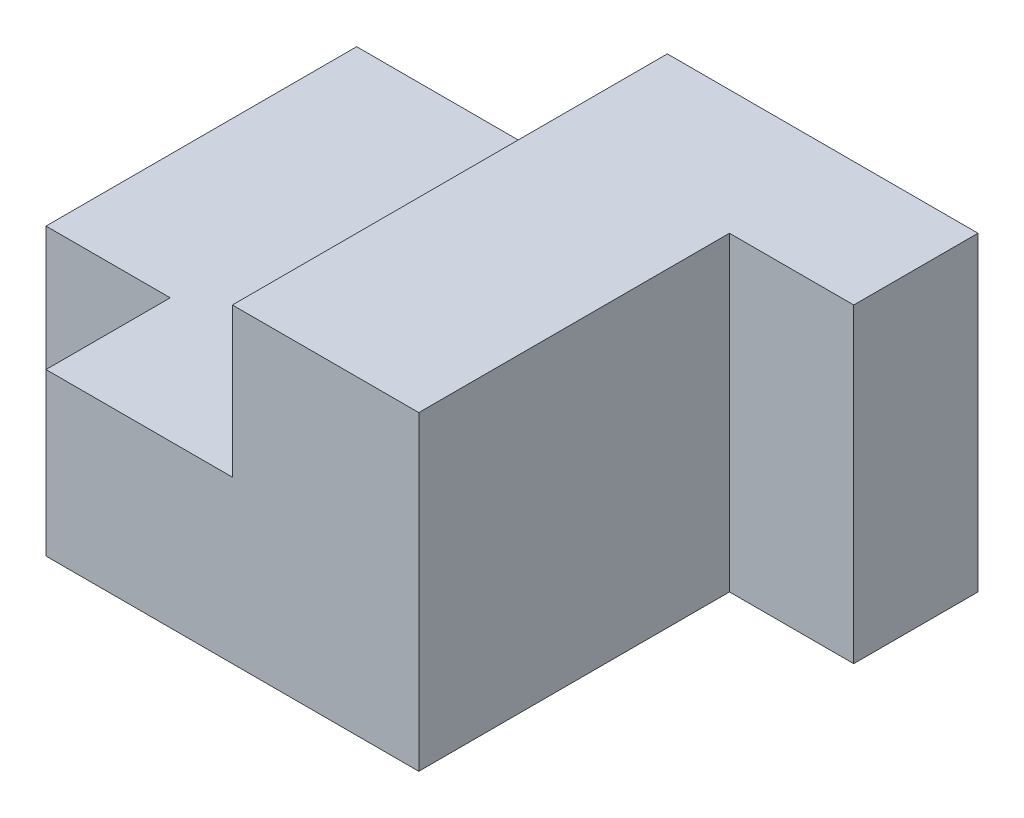
ISO-10303-21;
HEADER;
FILE_DESCRIPTION(('STEP AP214'),'2;1');
FILE_NAME('part.step','',(''),(''),'','','');
FILE_SCHEMA(('AUTOMOTIVE_DESIGN { 1 0 10303 214 1 1 1 1 }'));
ENDSEC;
DATA;
#1=APPLICATION_CONTEXT('core data for automotive mechanical design processes');
#2=APPLICATION_PROTOCOL_DEFINITION('international standard','automotive_design',2000,#1);
#3=PRODUCT_CONTEXT('',#1,'mechanical');
#4=PRODUCT('Part','Part','',(#3));
#5=PRODUCT_RELATED_PRODUCT_CATEGORY('part','',(#4));
#6=PRODUCT_DEFINITION_FORMATION('','',#4);
#7=PRODUCT_DEFINITION_CONTEXT('part definition',#1,'design');
#8=PRODUCT_DEFINITION('design','',#6,#7);
#9=PRODUCT_DEFINITION_SHAPE('','',#8);
#10=(LENGTH_UNIT() NAMED_UNIT(*) SI_UNIT(.MILLI.,.METRE.));
#11=(NAMED_UNIT(*) PLANE_ANGLE_UNIT() SI_UNIT($,.RADIAN.));
#12=(NAMED_UNIT(*) SI_UNIT($,.STERADIAN.) SOLID_ANGLE_UNIT());
#13=UNCERTAINTY_MEASURE_WITH_UNIT(LENGTH_MEASURE(1.E-05),#10,'distance_accuracy_value','');
#14=(GEOMETRIC_REPRESENTATION_CONTEXT(3) GLOBAL_UNCERTAINTY_ASSIGNED_CONTEXT((#13)) GLOBAL_UNIT_ASSIGNED_CONTEXT((#10,
#11,#12)) REPRESENTATION_CONTEXT('',''));
#15=CARTESIAN_POINT('',(0.,0.,0.));
#16=DIRECTION('',(0.,0.,1.));
#17=DIRECTION('',(1.,0.,0.));
#18=AXIS2_PLACEMENT_3D('',#15,#16,#17);
#19=CARTESIAN_POINT('',(-22.5742574257426,50.,36.8811881188119));
#20=DIRECTION('',(1.,0.,0.));
#21=DIRECTION('',(0.,0.,-1.));
#22=AXIS2_PLACEMENT_3D('',#19,#20,#21);
#23=PLANE('',#22);
#24=DIRECTION('',(0.,0.,-1.));
#25=VECTOR('',#24,1.);
#26=CARTESIAN_POINT('',(-22.5742574257426,26.,-33.1188118811881));
#27=LINE('',#26,#25);
#28=CARTESIAN_POINT('',(-22.5742574257426,26.,36.8811881188119));
#29=VERTEX_POINT('',#28);
#30=CARTESIAN_POINT('',(-22.5742574257426,26.,-33.1188118811881));
#31=VERTEX_POINT('',#30);
#32=EDGE_CURVE('E49',#29,#31,#27,.T.);
#33=ORIENTED_EDGE('',*,*,#32,.F.);
#34=DIRECTION('',(0.,-1.,0.));
#35=VECTOR('',#34,1.);
#36=CARTESIAN_POINT('',(-22.5742574257426,50.,36.8811881188119));
#37=LINE('',#36,#35);
#38=CARTESIAN_POINT('',(-22.5742574257426,50.,36.8811881188119));
#39=VERTEX_POINT('',#38);
#40=EDGE_CURVE('E43',#39,#29,#37,.T.);
#41=ORIENTED_EDGE('',*,*,#40,.F.);
#42=DIRECTION('',(0.,0.,1.));
#43=VECTOR('',#42,1.);
#44=CARTESIAN_POINT('',(-22.5742574257426,50.,36.8811881188119));
#45=LINE('',#44,#43);
#46=CARTESIAN_POINT('',(-22.5742574257426,50.,-33.1188118811881));
#47=VERTEX_POINT('',#46);
#48=EDGE_CURVE('E85',#47,#39,#45,.T.);
#49=ORIENTED_EDGE('',*,*,#48,.F.);
#50=DIRECTION('',(0.,-1.,0.));
#51=VECTOR('',#50,1.);
#52=CARTESIAN_POINT('',(-22.5742574257426,50.,-33.1188118811881));
#53=LINE('',#52,#51);
#54=EDGE_CURVE('E11',#47,#31,#53,.T.);
#55=ORIENTED_EDGE('',*,*,#54,.T.);
#56=EDGE_LOOP('',(#33,#41,#49,#55));
#57=FACE_BOUND('',#56,.T.);
#58=ADVANCED_FACE('F35',(#57),#23,.F.);
#59=CARTESIAN_POINT('',(-22.5742574257426,50.,-33.1188118811881));
#60=DIRECTION('',(0.,0.,1.));
#61=DIRECTION('',(1.,0.,0.));
#62=AXIS2_PLACEMENT_3D('',#59,#60,#61);
#63=PLANE('',#62);
#64=DIRECTION('',(-1.,0.,0.));
#65=VECTOR('',#64,1.);
#66=CARTESIAN_POINT('',(-22.5742574257426,0.,-33.1188118811881));
#67=LINE('',#66,#65);
#68=CARTESIAN_POINT('',(27.4257425742574,0.,-33.1188118811881));
#69=VERTEX_POINT('',#68);
#70=CARTESIAN_POINT('',(-72.5742574257426,0.,-33.1188118811881));
#71=VERTEX_POINT('',#70);
#72=EDGE_CURVE('E123',#69,#71,#67,.T.);
#73=ORIENTED_EDGE('',*,*,#72,.T.);
#74=DIRECTION('',(0.,-1.,0.));
#75=VECTOR('',#74,1.);
#76=CARTESIAN_POINT('',(-72.5742574257426,26.,-33.1188118811881));
#77=LINE('',#76,#75);
#78=CARTESIAN_POINT('',(-72.5742574257426,26.,-33.1188118811881));
#79=VERTEX_POINT('',#78);
#80=EDGE_CURVE('E127',#79,#71,#77,.T.);
#81=ORIENTED_EDGE('',*,*,#80,.F.);
#82=DIRECTION('',(-1.,0.,0.));
#83=VECTOR('',#82,1.);
#84=CARTESIAN_POINT('',(-22.5742574257426,26.,-33.1188118811881));
#85=LINE('',#84,#83);
#86=EDGE_CURVE('E181',#31,#79,#85,.T.);
#87=ORIENTED_EDGE('',*,*,#86,.F.);
#88=ORIENTED_EDGE('',*,*,#54,.F.);
#89=DIRECTION('',(-1.,0.,0.));
#90=VECTOR('',#89,1.);
#91=CARTESIAN_POINT('',(-22.5742574257426,50.,-33.1188118811881));
#92=LINE('',#91,#90);
#93=CARTESIAN_POINT('',(27.4257425742574,50.,-33.1188118811881));
#94=VERTEX_POINT('',#93);
#95=EDGE_CURVE('E133',#94,#47,#92,.T.);
#96=ORIENTED_EDGE('',*,*,#95,.F.);
#97=DIRECTION('',(0.,-1.,0.));
#98=VECTOR('',#97,1.);
#99=CARTESIAN_POINT('',(27.4257425742574,50.,-33.1188118811881));
#100=LINE('',#99,#98);
#101=EDGE_CURVE('E119',#94,#69,#100,.T.);
#102=ORIENTED_EDGE('',*,*,#101,.T.);
#103=EDGE_LOOP('',(#73,#81,#87,#88,#96,#102));
#104=FACE_BOUND('',#103,.T.);
#105=ADVANCED_FACE('F37',(#104),#63,.F.);
#106=CARTESIAN_POINT('',(7.4257425742574,50.,36.8811881188119));
#107=DIRECTION('',(0.,0.,-1.));
#108=DIRECTION('',(-1.,0.,0.));
#109=AXIS2_PLACEMENT_3D('',#106,#107,#108);
#110=PLANE('',#109);
#111=DIRECTION('',(1.,0.,0.));
#112=VECTOR('',#111,1.);
#113=CARTESIAN_POINT('',(7.4257425742574,0.,36.8811881188119));
#114=LINE('',#113,#112);
#115=CARTESIAN_POINT('',(-52.5742574257426,0.,36.8811881188119));
#116=VERTEX_POINT('',#115);
#117=CARTESIAN_POINT('',(7.4257425742574,0.,36.8811881188119));
#118=VERTEX_POINT('',#117);
#119=EDGE_CURVE('E126',#116,#118,#114,.T.);
#120=ORIENTED_EDGE('',*,*,#119,.T.);
#121=DIRECTION('',(0.,-1.,0.));
#122=VECTOR('',#121,1.);
#123=CARTESIAN_POINT('',(7.4257425742574,50.,36.8811881188119));
#124=LINE('',#123,#122);
#125=CARTESIAN_POINT('',(7.4257425742574,50.,36.8811881188119));
#126=VERTEX_POINT('',#125);
#127=EDGE_CURVE('E114',#126,#118,#124,.T.);
#128=ORIENTED_EDGE('',*,*,#127,.F.);
#129=DIRECTION('',(1.,0.,0.));
#130=VECTOR('',#129,1.);
#131=CARTESIAN_POINT('',(7.4257425742574,50.,36.8811881188119));
#132=LINE('',#131,#130);
#133=EDGE_CURVE('E102',#39,#126,#132,.T.);
#134=ORIENTED_EDGE('',*,*,#133,.F.);
#135=ORIENTED_EDGE('',*,*,#40,.T.);
#136=DIRECTION('',(1.,0.,0.));
#137=VECTOR('',#136,1.);
#138=CARTESIAN_POINT('',(-22.5742574257426,26.,36.8811881188119));
#139=LINE('',#138,#137);
#140=CARTESIAN_POINT('',(-52.5742574257426,26.,36.8811881188119));
#141=VERTEX_POINT('',#140);
#142=EDGE_CURVE('E141',#141,#29,#139,.T.);
#143=ORIENTED_EDGE('',*,*,#142,.F.);
#144=DIRECTION('',(0.,-1.,0.));
#145=VECTOR('',#144,1.);
#146=CARTESIAN_POINT('',(-52.5742574257426,26.,36.8811881188119));
#147=LINE('',#146,#145);
#148=EDGE_CURVE('E151',#141,#116,#147,.T.);
#149=ORIENTED_EDGE('',*,*,#148,.T.);
#150=EDGE_LOOP('',(#120,#128,#134,#135,#143,#149));
#151=FACE_BOUND('',#150,.T.);
#152=ADVANCED_FACE('F139',(#151),#110,.F.);
#153=CARTESIAN_POINT('',(7.42574257425739,50.,-13.1188118811881));
#154=DIRECTION('',(-1.,0.,0.));
#155=DIRECTION('',(0.,0.,1.));
#156=AXIS2_PLACEMENT_3D('',#153,#154,#155);
#157=PLANE('',#156);
#158=DIRECTION('',(0.,0.,-1.));
#159=VECTOR('',#158,1.);
#160=CARTESIAN_POINT('',(7.42574257425739,0.,-13.1188118811881));
#161=LINE('',#160,#159);
#162=CARTESIAN_POINT('',(7.42574257425739,0.,-13.1188118811881));
#163=VERTEX_POINT('',#162);
#164=EDGE_CURVE('E111',#118,#163,#161,.T.);
#165=ORIENTED_EDGE('',*,*,#164,.T.);
#166=DIRECTION('',(0.,-1.,0.));
#167=VECTOR('',#166,1.);
#168=CARTESIAN_POINT('',(7.42574257425739,50.,-13.1188118811881));
#169=LINE('',#168,#167);
#170=CARTESIAN_POINT('',(7.42574257425739,50.,-13.1188118811881));
#171=VERTEX_POINT('',#170);
#172=EDGE_CURVE('E108',#171,#163,#169,.T.);
#173=ORIENTED_EDGE('',*,*,#172,.F.);
#174=DIRECTION('',(0.,0.,-1.));
#175=VECTOR('',#174,1.);
#176=CARTESIAN_POINT('',(7.42574257425739,50.,-13.1188118811881));
#177=LINE('',#176,#175);
#178=EDGE_CURVE('E95',#126,#171,#177,.T.);
#179=ORIENTED_EDGE('',*,*,#178,.F.);
#180=ORIENTED_EDGE('',*,*,#127,.T.);
#181=EDGE_LOOP('',(#165,#173,#179,#180));
#182=FACE_BOUND('',#181,.T.);
#183=ADVANCED_FACE('F109',(#182),#157,.F.);
#184=CARTESIAN_POINT('',(27.4257425742574,50.,-13.1188118811881));
#185=DIRECTION('',(0.,0.,-1.));
#186=DIRECTION('',(-1.,0.,0.));
#187=AXIS2_PLACEMENT_3D('',#184,#185,#186);
#188=PLANE('',#187);
#189=DIRECTION('',(1.,0.,0.));
#190=VECTOR('',#189,1.);
#191=CARTESIAN_POINT('',(27.4257425742574,0.,-13.1188118811881));
#192=LINE('',#191,#190);
#193=CARTESIAN_POINT('',(27.4257425742574,0.,-13.1188118811881));
#194=VERTEX_POINT('',#193);
#195=EDGE_CURVE('E130',#163,#194,#192,.T.);
#196=ORIENTED_EDGE('',*,*,#195,.T.);
#197=DIRECTION('',(0.,-1.,0.));
#198=VECTOR('',#197,1.);
#199=CARTESIAN_POINT('',(27.4257425742574,50.,-13.1188118811881));
#200=LINE('',#199,#198);
#201=CARTESIAN_POINT('',(27.4257425742574,50.,-13.1188118811881));
#202=VERTEX_POINT('',#201);
#203=EDGE_CURVE('E115',#202,#194,#200,.T.);
#204=ORIENTED_EDGE('',*,*,#203,.F.);
#205=DIRECTION('',(1.,0.,0.));
#206=VECTOR('',#205,1.);
#207=CARTESIAN_POINT('',(27.4257425742574,50.,-13.1188118811881));
#208=LINE('',#207,#206);
#209=EDGE_CURVE('E99',#171,#202,#208,.T.);
#210=ORIENTED_EDGE('',*,*,#209,.F.);
#211=ORIENTED_EDGE('',*,*,#172,.T.);
#212=EDGE_LOOP('',(#196,#204,#210,#211));
#213=FACE_BOUND('',#212,.T.);
#214=ADVANCED_FACE('F117',(#213),#188,.F.);
#215=CARTESIAN_POINT('',(27.4257425742574,50.,-33.1188118811881));
#216=DIRECTION('',(-1.,0.,0.));
#217=DIRECTION('',(0.,0.,1.));
#218=AXIS2_PLACEMENT_3D('',#215,#216,#217);
#219=PLANE('',#218);
#220=DIRECTION('',(0.,0.,-1.));
#221=VECTOR('',#220,1.);
#222=CARTESIAN_POINT('',(27.4257425742574,0.,-33.1188118811881));
#223=LINE('',#222,#221);
#224=EDGE_CURVE('E79',#194,#69,#223,.T.);
#225=ORIENTED_EDGE('',*,*,#224,.T.);
#226=ORIENTED_EDGE('',*,*,#101,.F.);
#227=DIRECTION('',(0.,0.,-1.));
#228=VECTOR('',#227,1.);
#229=CARTESIAN_POINT('',(27.4257425742574,50.,-33.1188118811881));
#230=LINE('',#229,#228);
#231=EDGE_CURVE('E58',#202,#94,#230,.T.);
#232=ORIENTED_EDGE('',*,*,#231,.F.);
#233=ORIENTED_EDGE('',*,*,#203,.T.);
#234=EDGE_LOOP('',(#225,#226,#232,#233));
#235=FACE_BOUND('',#234,.T.);
#236=ADVANCED_FACE('F210',(#235),#219,.F.);
#237=CARTESIAN_POINT('',(0.,50.,0.));
#238=DIRECTION('',(0.,-1.,0.));
#239=DIRECTION('',(0.,0.,-1.));
#240=AXIS2_PLACEMENT_3D('',#237,#238,#239);
#241=PLANE('',#240);
#242=ORIENTED_EDGE('',*,*,#95,.T.);
#243=ORIENTED_EDGE('',*,*,#48,.T.);
#244=ORIENTED_EDGE('',*,*,#133,.T.);
#245=ORIENTED_EDGE('',*,*,#178,.T.);
#246=ORIENTED_EDGE('',*,*,#209,.T.);
#247=ORIENTED_EDGE('',*,*,#231,.T.);
#248=EDGE_LOOP('',(#242,#243,#244,#245,#246,#247));
#249=FACE_BOUND('',#248,.T.);
#250=ADVANCED_FACE('F97',(#249),#241,.F.);
#251=CARTESIAN_POINT('',(0.,0.,0.));
#252=DIRECTION('',(0.,-1.,0.));
#253=DIRECTION('',(0.,0.,-1.));
#254=AXIS2_PLACEMENT_3D('',#251,#252,#253);
#255=PLANE('',#254);
#256=ORIENTED_EDGE('',*,*,#72,.F.);
#257=ORIENTED_EDGE('',*,*,#224,.F.);
#258=ORIENTED_EDGE('',*,*,#195,.F.);
#259=ORIENTED_EDGE('',*,*,#164,.F.);
#260=ORIENTED_EDGE('',*,*,#119,.F.);
#261=DIRECTION('',(0.,0.,1.));
#262=VECTOR('',#261,1.);
#263=CARTESIAN_POINT('',(-52.5742574257426,0.,16.8811881188119));
#264=LINE('',#263,#262);
#265=CARTESIAN_POINT('',(-52.5742574257426,0.,16.8811881188119));
#266=VERTEX_POINT('',#265);
#267=EDGE_CURVE('E165',#266,#116,#264,.T.);
#268=ORIENTED_EDGE('',*,*,#267,.F.);
#269=DIRECTION('',(1.,0.,0.));
#270=VECTOR('',#269,1.);
#271=CARTESIAN_POINT('',(-72.5742574257426,0.,16.8811881188119));
#272=LINE('',#271,#270);
#273=CARTESIAN_POINT('',(-72.5742574257426,0.,16.8811881188119));
#274=VERTEX_POINT('',#273);
#275=EDGE_CURVE('E162',#274,#266,#272,.T.);
#276=ORIENTED_EDGE('',*,*,#275,.F.);
#277=DIRECTION('',(0.,0.,1.));
#278=VECTOR('',#277,1.);
#279=CARTESIAN_POINT('',(-72.5742574257426,0.,-33.1188118811881));
#280=LINE('',#279,#278);
#281=EDGE_CURVE('E159',#71,#274,#280,.T.);
#282=ORIENTED_EDGE('',*,*,#281,.F.);
#283=EDGE_LOOP('',(#256,#257,#258,#259,#260,#268,#276,#282));
#284=FACE_BOUND('',#283,.T.);
#285=ADVANCED_FACE('F209',(#284),#255,.T.);
#286=CARTESIAN_POINT('',(-72.5742574257426,26.,-33.1188118811881));
#287=DIRECTION('',(1.,0.,0.));
#288=DIRECTION('',(0.,0.,-1.));
#289=AXIS2_PLACEMENT_3D('',#286,#287,#288);
#290=PLANE('',#289);
#291=ORIENTED_EDGE('',*,*,#281,.T.);
#292=DIRECTION('',(0.,-1.,0.));
#293=VECTOR('',#292,1.);
#294=CARTESIAN_POINT('',(-72.5742574257426,26.,16.8811881188119));
#295=LINE('',#294,#293);
#296=CARTESIAN_POINT('',(-72.5742574257426,26.,16.8811881188119));
#297=VERTEX_POINT('',#296);
#298=EDGE_CURVE('E170',#297,#274,#295,.T.);
#299=ORIENTED_EDGE('',*,*,#298,.F.);
#300=DIRECTION('',(0.,0.,1.));
#301=VECTOR('',#300,1.);
#302=CARTESIAN_POINT('',(-72.5742574257426,26.,-33.1188118811881));
#303=LINE('',#302,#301);
#304=EDGE_CURVE('E214',#79,#297,#303,.T.);
#305=ORIENTED_EDGE('',*,*,#304,.F.);
#306=ORIENTED_EDGE('',*,*,#80,.T.);
#307=EDGE_LOOP('',(#291,#299,#305,#306));
#308=FACE_BOUND('',#307,.T.);
#309=ADVANCED_FACE('F212',(#308),#290,.F.);
#310=CARTESIAN_POINT('',(-72.5742574257426,26.,16.8811881188119));
#311=DIRECTION('',(0.,0.,-1.));
#312=DIRECTION('',(-1.,0.,0.));
#313=AXIS2_PLACEMENT_3D('',#310,#311,#312);
#314=PLANE('',#313);
#315=ORIENTED_EDGE('',*,*,#275,.T.);
#316=DIRECTION('',(0.,-1.,0.));
#317=VECTOR('',#316,1.);
#318=CARTESIAN_POINT('',(-52.5742574257426,26.,16.8811881188119));
#319=LINE('',#318,#317);
#320=CARTESIAN_POINT('',(-52.5742574257426,26.,16.8811881188119));
#321=VERTEX_POINT('',#320);
#322=EDGE_CURVE('E153',#321,#266,#319,.T.);
#323=ORIENTED_EDGE('',*,*,#322,.F.);
#324=DIRECTION('',(1.,0.,0.));
#325=VECTOR('',#324,1.);
#326=CARTESIAN_POINT('',(-72.5742574257426,26.,16.8811881188119));
#327=LINE('',#326,#325);
#328=EDGE_CURVE('E155',#297,#321,#327,.T.);
#329=ORIENTED_EDGE('',*,*,#328,.F.);
#330=ORIENTED_EDGE('',*,*,#298,.T.);
#331=EDGE_LOOP('',(#315,#323,#329,#330));
#332=FACE_BOUND('',#331,.T.);
#333=ADVANCED_FACE('F200',(#332),#314,.F.);
#334=CARTESIAN_POINT('',(-52.5742574257426,26.,16.8811881188119));
#335=DIRECTION('',(1.,0.,0.));
#336=DIRECTION('',(0.,0.,-1.));
#337=AXIS2_PLACEMENT_3D('',#334,#335,#336);
#338=PLANE('',#337);
#339=ORIENTED_EDGE('',*,*,#267,.T.);
#340=ORIENTED_EDGE('',*,*,#148,.F.);
#341=DIRECTION('',(0.,0.,1.));
#342=VECTOR('',#341,1.);
#343=CARTESIAN_POINT('',(-52.5742574257426,26.,16.8811881188119));
#344=LINE('',#343,#342);
#345=EDGE_CURVE('E149',#321,#141,#344,.T.);
#346=ORIENTED_EDGE('',*,*,#345,.F.);
#347=ORIENTED_EDGE('',*,*,#322,.T.);
#348=EDGE_LOOP('',(#339,#340,#346,#347));
#349=FACE_BOUND('',#348,.T.);
#350=ADVANCED_FACE('F207',(#349),#338,.F.);
#351=CARTESIAN_POINT('',(0.,26.,0.));
#352=DIRECTION('',(0.,-1.,0.));
#353=DIRECTION('',(0.,0.,-1.));
#354=AXIS2_PLACEMENT_3D('',#351,#352,#353);
#355=PLANE('',#354);
#356=ORIENTED_EDGE('',*,*,#32,.T.);
#357=ORIENTED_EDGE('',*,*,#86,.T.);
#358=ORIENTED_EDGE('',*,*,#304,.T.);
#359=ORIENTED_EDGE('',*,*,#328,.T.);
#360=ORIENTED_EDGE('',*,*,#345,.T.);
#361=ORIENTED_EDGE('',*,*,#142,.T.);
#362=EDGE_LOOP('',(#356,#357,#358,#359,#360,#361));
#363=FACE_BOUND('',#362,.T.);
#364=ADVANCED_FACE('F144',(#363),#355,.F.);
#365=CLOSED_SHELL('',(#58,#105,#152,#183,#214,#236,#250,#285,#309,#333,#350,#364));
#366=MANIFOLD_SOLID_BREP('B2',#365);
#367=ADVANCED_BREP_SHAPE_REPRESENTATION('',(#18,#366),#14);
#368=SHAPE_DEFINITION_REPRESENTATION(#9,#367);
ENDSEC;
END-ISO-10303-21;
